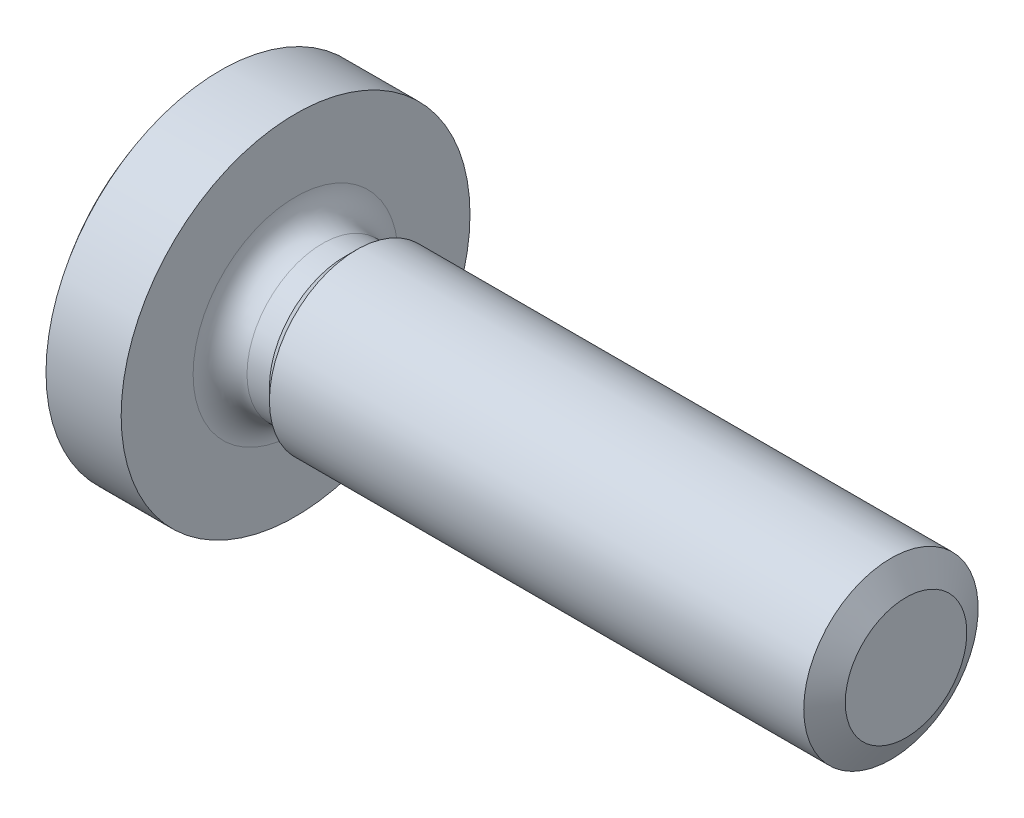
ISO-10303-21;
HEADER;
FILE_DESCRIPTION(('STEP AP214'),'2;1');
FILE_NAME('part.step','',(''),(''),'','','');
FILE_SCHEMA(('AUTOMOTIVE_DESIGN { 1 0 10303 214 1 1 1 1 }'));
ENDSEC;
DATA;
#1=APPLICATION_CONTEXT('core data for automotive mechanical design processes');
#2=APPLICATION_PROTOCOL_DEFINITION('international standard','automotive_design',2000,#1);
#3=PRODUCT_CONTEXT('',#1,'mechanical');
#4=PRODUCT('Part','Part','',(#3));
#5=PRODUCT_RELATED_PRODUCT_CATEGORY('part','',(#4));
#6=PRODUCT_DEFINITION_FORMATION('','',#4);
#7=PRODUCT_DEFINITION_CONTEXT('part definition',#1,'design');
#8=PRODUCT_DEFINITION('design','',#6,#7);
#9=PRODUCT_DEFINITION_SHAPE('','',#8);
#10=(LENGTH_UNIT() NAMED_UNIT(*) SI_UNIT(.MILLI.,.METRE.));
#11=(NAMED_UNIT(*) PLANE_ANGLE_UNIT() SI_UNIT($,.RADIAN.));
#12=(NAMED_UNIT(*) SI_UNIT($,.STERADIAN.) SOLID_ANGLE_UNIT());
#13=UNCERTAINTY_MEASURE_WITH_UNIT(LENGTH_MEASURE(1.E-05),#10,'distance_accuracy_value','');
#14=(GEOMETRIC_REPRESENTATION_CONTEXT(3) GLOBAL_UNCERTAINTY_ASSIGNED_CONTEXT((#13)) GLOBAL_UNIT_ASSIGNED_CONTEXT((#10,
#11,#12)) REPRESENTATION_CONTEXT('',''));
#15=CARTESIAN_POINT('',(0.,0.,0.));
#16=DIRECTION('',(0.,0.,1.));
#17=DIRECTION('',(1.,0.,0.));
#18=AXIS2_PLACEMENT_3D('',#15,#16,#17);
#19=CARTESIAN_POINT('',(2.4,0.,0.));
#20=DIRECTION('',(0.144306893071729,0.,-0.989532981063282));
#21=DIRECTION('',(-0.989532981063282,0.,-0.144306893071729));
#22=AXIS2_PLACEMENT_3D('',#19,#20,#21);
#23=PLANE('',#22);
#24=DIRECTION('',(-0.732931208059297,-0.671853607387689,-0.106885801175314));
#25=VECTOR('',#24,1.);
#26=CARTESIAN_POINT('',(2.4,0.,0.));
#27=LINE('',#26,#25);
#28=CARTESIAN_POINT('',(2.4,0.,0.));
#29=VERTEX_POINT('',#28);
#30=CARTESIAN_POINT('',(0.299339193338267,-1.92560573943992,-0.30634636763817));
#31=VERTEX_POINT('',#30);
#32=EDGE_CURVE('E155',#29,#31,#27,.T.);
#33=ORIENTED_EDGE('',*,*,#32,.F.);
#34=DIRECTION('',(-0.979387903800927,-0.142827402637635,-0.142827402637635));
#35=VECTOR('',#34,1.);
#36=CARTESIAN_POINT('',(2.4,0.,0.));
#37=LINE('',#36,#35);
#38=CARTESIAN_POINT('',(0.0185820115886168,-0.347290123309992,-0.347290123309993));
#39=VERTEX_POINT('',#38);
#40=EDGE_CURVE('E116',#29,#39,#37,.T.);
#41=ORIENTED_EDGE('',*,*,#40,.T.);
#42=CARTESIAN_POINT('',(6.41461963450914,0.,0.585465363365916));
#43=DIRECTION('',(0.144306893071729,0.,-0.989532981063282));
#44=DIRECTION('',(-0.989532981063282,0.,-0.144306893071729));
#45=AXIS2_PLACEMENT_3D('',#42,#43,#44);
#46=CIRCLE('',#45,6.47301633718682);
#47=EDGE_CURVE('E129',#31,#39,#46,.T.);
#48=ORIENTED_EDGE('',*,*,#47,.F.);
#49=EDGE_LOOP('',(#33,#41,#48));
#50=FACE_BOUND('',#49,.T.);
#51=ADVANCED_FACE('F36',(#50),#23,.F.);
#52=CARTESIAN_POINT('',(2.4,0.,0.));
#53=DIRECTION('',(0.144306893071729,0.,0.989532981063282));
#54=DIRECTION('',(0.989532981063282,0.,-0.144306893071729));
#55=AXIS2_PLACEMENT_3D('',#52,#53,#54);
#56=PLANE('',#55);
#57=CARTESIAN_POINT('',(6.41461963450914,0.,-0.585465363365916));
#58=DIRECTION('',(0.144306893071729,0.,0.989532981063282));
#59=DIRECTION('',(0.989532981063282,0.,-0.144306893071729));
#60=AXIS2_PLACEMENT_3D('',#57,#58,#59);
#61=CIRCLE('',#60,6.47301633718682);
#62=CARTESIAN_POINT('',(0.0185820115886177,-0.347290123309995,0.347290123309993));
#63=VERTEX_POINT('',#62);
#64=CARTESIAN_POINT('',(0.299339193338266,-1.92560573943992,0.30634636763817));
#65=VERTEX_POINT('',#64);
#66=EDGE_CURVE('E59',#63,#65,#61,.T.);
#67=ORIENTED_EDGE('',*,*,#66,.F.);
#68=DIRECTION('',(0.979387903800927,0.142827402637636,-0.142827402637635));
#69=VECTOR('',#68,1.);
#70=CARTESIAN_POINT('',(2.4,0.,0.));
#71=LINE('',#70,#69);
#72=EDGE_CURVE('E11',#63,#29,#71,.T.);
#73=ORIENTED_EDGE('',*,*,#72,.T.);
#74=DIRECTION('',(-0.732931208059297,-0.671853607387689,0.106885801175314));
#75=VECTOR('',#74,1.);
#76=CARTESIAN_POINT('',(2.4,0.,0.));
#77=LINE('',#76,#75);
#78=EDGE_CURVE('E156',#29,#65,#77,.T.);
#79=ORIENTED_EDGE('',*,*,#78,.T.);
#80=EDGE_LOOP('',(#67,#73,#79));
#81=FACE_BOUND('',#80,.T.);
#82=ADVANCED_FACE('F171',(#81),#56,.F.);
#83=CARTESIAN_POINT('',(-1.33175770411172,0.,0.));
#84=DIRECTION('',(-1.,0.,0.));
#85=DIRECTION('',(0.,0.,1.));
#86=AXIS2_PLACEMENT_3D('',#83,#84,#85);
#87=CYLINDRICAL_SURFACE('',#86,2.);
#88=CARTESIAN_POINT('',(4.5,0.,0.));
#89=DIRECTION('',(-1.,0.,0.));
#90=DIRECTION('',(0.,0.,1.));
#91=AXIS2_PLACEMENT_3D('',#88,#89,#90);
#92=CIRCLE('',#91,2.);
#93=CARTESIAN_POINT('',(4.5,0.,2.));
#94=VERTEX_POINT('',#93);
#95=EDGE_CURVE('E192',#94,#94,#92,.T.);
#96=ORIENTED_EDGE('',*,*,#95,.F.);
#97=EDGE_LOOP('',(#96));
#98=FACE_BOUND('',#97,.T.);
#99=CARTESIAN_POINT('',(16.753791204021,0.,0.));
#100=DIRECTION('',(-1.,0.,0.));
#101=DIRECTION('',(0.,0.,1.));
#102=AXIS2_PLACEMENT_3D('',#99,#100,#101);
#103=CIRCLE('',#102,2.);
#104=CARTESIAN_POINT('',(16.753791204021,0.,2.));
#105=VERTEX_POINT('',#104);
#106=EDGE_CURVE('E189',#105,#105,#103,.T.);
#107=ORIENTED_EDGE('',*,*,#106,.T.);
#108=EDGE_LOOP('',(#107));
#109=FACE_BOUND('',#108,.T.);
#110=ADVANCED_FACE('F236',(#98,#109),#87,.T.);
#111=CARTESIAN_POINT('',(6.5,0.,0.));
#112=DIRECTION('',(-1.,0.,0.));
#113=DIRECTION('',(0.,1.,0.));
#114=AXIS2_PLACEMENT_3D('',#111,#112,#113);
#115=SPHERICAL_SURFACE('',#114,6.5);
#116=CARTESIAN_POINT('',(4.62792452830189,0.,-2.0422641509434));
#117=DIRECTION('',(0.675724628517346,0.,0.737154140200741));
#118=DIRECTION('',(0.737154140200741,0.,-0.675724628517346));
#119=AXIS2_PLACEMENT_3D('',#116,#117,#118);
#120=CIRCLE('',#119,5.88000770118864);
#121=CARTESIAN_POINT('',(0.299339193338266,0.306346367638162,1.92560573943992));
#122=VERTEX_POINT('',#121);
#123=CARTESIAN_POINT('',(0.299339193338267,-0.306346367638176,1.92560573943992));
#124=VERTEX_POINT('',#123);
#125=EDGE_CURVE('E122',#122,#124,#120,.T.);
#126=ORIENTED_EDGE('',*,*,#125,.T.);
#127=CARTESIAN_POINT('',(6.41461963450914,0.585465363365916,0.));
#128=DIRECTION('',(0.144306893071729,-0.989532981063282,0.));
#129=DIRECTION('',(0.989532981063282,0.144306893071729,0.));
#130=AXIS2_PLACEMENT_3D('',#127,#128,#129);
#131=CIRCLE('',#130,6.47301633718682);
#132=EDGE_CURVE('E138',#124,#63,#131,.T.);
#133=ORIENTED_EDGE('',*,*,#132,.T.);
#134=ORIENTED_EDGE('',*,*,#66,.T.);
#135=CARTESIAN_POINT('',(4.62792452830189,2.0422641509434,0.));
#136=DIRECTION('',(0.675724628517346,-0.737154140200741,0.));
#137=DIRECTION('',(0.737154140200741,0.675724628517346,0.));
#138=AXIS2_PLACEMENT_3D('',#135,#136,#137);
#139=CIRCLE('',#138,5.88000770118864);
#140=EDGE_CURVE('E168',#65,#31,#139,.T.);
#141=ORIENTED_EDGE('',*,*,#140,.T.);
#142=ORIENTED_EDGE('',*,*,#47,.T.);
#143=CARTESIAN_POINT('',(0.299339193338267,-0.306346367638163,-1.92560573943992));
#144=VERTEX_POINT('',#143);
#145=EDGE_CURVE('E118',#39,#144,#131,.T.);
#146=ORIENTED_EDGE('',*,*,#145,.T.);
#147=CARTESIAN_POINT('',(4.62792452830189,0.,2.0422641509434));
#148=DIRECTION('',(0.675724628517346,0.,-0.737154140200741));
#149=DIRECTION('',(-0.737154140200741,0.,-0.675724628517346));
#150=AXIS2_PLACEMENT_3D('',#147,#148,#149);
#151=CIRCLE('',#150,5.88000770118864);
#152=CARTESIAN_POINT('',(0.299339193338266,0.306346367638176,-1.92560573943992));
#153=VERTEX_POINT('',#152);
#154=EDGE_CURVE('E110',#144,#153,#151,.T.);
#155=ORIENTED_EDGE('',*,*,#154,.T.);
#156=CARTESIAN_POINT('',(6.41461963450914,-0.585465363365916,0.));
#157=DIRECTION('',(0.144306893071729,0.989532981063282,0.));
#158=DIRECTION('',(-0.989532981063282,0.144306893071729,0.));
#159=AXIS2_PLACEMENT_3D('',#156,#157,#158);
#160=CIRCLE('',#159,6.47301633718682);
#161=CARTESIAN_POINT('',(0.0185820115886177,0.347290123309994,-0.347290123309993));
#162=VERTEX_POINT('',#161);
#163=EDGE_CURVE('E101',#153,#162,#160,.T.);
#164=ORIENTED_EDGE('',*,*,#163,.T.);
#165=CARTESIAN_POINT('',(0.299339193338267,1.92560573943992,-0.30634636763817));
#166=VERTEX_POINT('',#165);
#167=EDGE_CURVE('E146',#162,#166,#46,.T.);
#168=ORIENTED_EDGE('',*,*,#167,.T.);
#169=CARTESIAN_POINT('',(4.62792452830189,-2.0422641509434,0.));
#170=DIRECTION('',(0.675724628517346,0.737154140200741,0.));
#171=DIRECTION('',(-0.737154140200741,0.675724628517346,0.));
#172=AXIS2_PLACEMENT_3D('',#169,#170,#171);
#173=CIRCLE('',#172,5.88000770118864);
#174=CARTESIAN_POINT('',(0.299339193338266,1.92560573943992,0.306346367638169));
#175=VERTEX_POINT('',#174);
#176=EDGE_CURVE('E159',#166,#175,#173,.T.);
#177=ORIENTED_EDGE('',*,*,#176,.T.);
#178=CARTESIAN_POINT('',(0.0185820115886168,0.347290123309992,0.347290123309993));
#179=VERTEX_POINT('',#178);
#180=EDGE_CURVE('E151',#175,#179,#61,.T.);
#181=ORIENTED_EDGE('',*,*,#180,.T.);
#182=EDGE_CURVE('E51',#179,#122,#160,.T.);
#183=ORIENTED_EDGE('',*,*,#182,.T.);
#184=EDGE_LOOP('',(#126,#133,#134,#141,#142,#146,#155,#164,#168,#177,#181,#183));
#185=FACE_BOUND('',#184,.T.);
#186=CARTESIAN_POINT('',(1.3765246170202,0.,0.));
#187=DIRECTION('',(-1.,0.,0.));
#188=DIRECTION('',(0.,0.,1.));
#189=AXIS2_PLACEMENT_3D('',#186,#187,#188);
#190=CIRCLE('',#189,4.);
#191=CARTESIAN_POINT('',(1.3765246170202,0.,4.));
#192=VERTEX_POINT('',#191);
#193=EDGE_CURVE('E172',#192,#192,#190,.T.);
#194=ORIENTED_EDGE('',*,*,#193,.T.);
#195=EDGE_LOOP('',(#194));
#196=FACE_BOUND('',#195,.T.);
#197=ADVANCED_FACE('F38',(#185,#196),#115,.T.);
#198=CARTESIAN_POINT('',(-1.33175770411172,0.,0.));
#199=DIRECTION('',(-1.,0.,0.));
#200=DIRECTION('',(0.,0.,1.));
#201=AXIS2_PLACEMENT_3D('',#198,#199,#200);
#202=CYLINDRICAL_SURFACE('',#201,4.);
#203=ORIENTED_EDGE('',*,*,#193,.F.);
#204=EDGE_LOOP('',(#203));
#205=FACE_BOUND('',#204,.T.);
#206=CARTESIAN_POINT('',(3.1,0.,0.));
#207=DIRECTION('',(-1.,0.,0.));
#208=DIRECTION('',(0.,0.,1.));
#209=AXIS2_PLACEMENT_3D('',#206,#207,#208);
#210=CIRCLE('',#209,4.);
#211=CARTESIAN_POINT('',(3.1,0.,4.));
#212=VERTEX_POINT('',#211);
#213=EDGE_CURVE('E175',#212,#212,#210,.T.);
#214=ORIENTED_EDGE('',*,*,#213,.T.);
#215=EDGE_LOOP('',(#214));
#216=FACE_BOUND('',#215,.T.);
#217=ADVANCED_FACE('F209',(#205,#216),#202,.T.);
#218=CARTESIAN_POINT('',(3.1,2.35,0.));
#219=DIRECTION('',(-1.,0.,0.));
#220=DIRECTION('',(0.,0.,1.));
#221=AXIS2_PLACEMENT_3D('',#218,#219,#220);
#222=PLANE('',#221);
#223=ORIENTED_EDGE('',*,*,#213,.F.);
#224=EDGE_LOOP('',(#223));
#225=FACE_BOUND('',#224,.T.);
#226=CARTESIAN_POINT('',(3.1,0.,0.));
#227=DIRECTION('',(-1.,0.,0.));
#228=DIRECTION('',(0.,0.,1.));
#229=AXIS2_PLACEMENT_3D('',#226,#227,#228);
#230=CIRCLE('',#229,2.35);
#231=CARTESIAN_POINT('',(3.1,0.,2.35));
#232=VERTEX_POINT('',#231);
#233=EDGE_CURVE('E201',#232,#232,#230,.T.);
#234=ORIENTED_EDGE('',*,*,#233,.T.);
#235=EDGE_LOOP('',(#234));
#236=FACE_BOUND('',#235,.T.);
#237=ADVANCED_FACE('F211',(#225,#236),#222,.F.);
#238=CARTESIAN_POINT('',(3.718,0.,0.));
#239=DIRECTION('',(-1.,0.,0.));
#240=DIRECTION('',(0.,0.,1.));
#241=AXIS2_PLACEMENT_3D('',#238,#239,#240);
#242=TOROIDAL_SURFACE('',#241,2.35,0.618);
#243=ORIENTED_EDGE('',*,*,#233,.F.);
#244=EDGE_LOOP('',(#243));
#245=FACE_BOUND('',#244,.T.);
#246=CARTESIAN_POINT('',(3.718,0.,0.));
#247=DIRECTION('',(-1.,0.,0.));
#248=DIRECTION('',(0.,0.,1.));
#249=AXIS2_PLACEMENT_3D('',#246,#247,#248);
#250=CIRCLE('',#249,1.732);
#251=CARTESIAN_POINT('',(3.718,0.,1.732));
#252=VERTEX_POINT('',#251);
#253=EDGE_CURVE('E198',#252,#252,#250,.T.);
#254=ORIENTED_EDGE('',*,*,#253,.T.);
#255=EDGE_LOOP('',(#254));
#256=FACE_BOUND('',#255,.T.);
#257=ADVANCED_FACE('F214',(#245,#256),#242,.F.);
#258=CARTESIAN_POINT('',(-1.33175770411172,0.,0.));
#259=DIRECTION('',(-1.,0.,0.));
#260=DIRECTION('',(0.,0.,1.));
#261=AXIS2_PLACEMENT_3D('',#258,#259,#260);
#262=CYLINDRICAL_SURFACE('',#261,1.732);
#263=ORIENTED_EDGE('',*,*,#253,.F.);
#264=EDGE_LOOP('',(#263));
#265=FACE_BOUND('',#264,.T.);
#266=CARTESIAN_POINT('',(4.232,0.,0.));
#267=DIRECTION('',(-1.,0.,0.));
#268=DIRECTION('',(0.,0.,1.));
#269=AXIS2_PLACEMENT_3D('',#266,#267,#268);
#270=CIRCLE('',#269,1.732);
#271=CARTESIAN_POINT('',(4.232,0.,1.732));
#272=VERTEX_POINT('',#271);
#273=EDGE_CURVE('E195',#272,#272,#270,.T.);
#274=ORIENTED_EDGE('',*,*,#273,.T.);
#275=EDGE_LOOP('',(#274));
#276=FACE_BOUND('',#275,.T.);
#277=ADVANCED_FACE('F220',(#265,#276),#262,.T.);
#278=CARTESIAN_POINT('',(4.5,0.,0.));
#279=DIRECTION('',(1.,0.,0.));
#280=DIRECTION('',(0.,0.,-1.));
#281=AXIS2_PLACEMENT_3D('',#278,#279,#280);
#282=CONICAL_SURFACE('',#281,2.,0.785398163397443);
#283=ORIENTED_EDGE('',*,*,#273,.F.);
#284=EDGE_LOOP('',(#283));
#285=FACE_BOUND('',#284,.T.);
#286=ORIENTED_EDGE('',*,*,#95,.T.);
#287=EDGE_LOOP('',(#286));
#288=FACE_BOUND('',#287,.T.);
#289=ADVANCED_FACE('F226',(#285,#288),#282,.T.);
#290=CARTESIAN_POINT('',(16.753791204021,0.,0.));
#291=DIRECTION('',(-1.,0.,0.));
#292=DIRECTION('',(0.,0.,1.));
#293=AXIS2_PLACEMENT_3D('',#290,#291,#292);
#294=CONICAL_SURFACE('',#293,2.,1.05188801855299);
#295=CARTESIAN_POINT('',(17.1,0.,0.));
#296=DIRECTION('',(-1.,0.,0.));
#297=DIRECTION('',(0.,0.,1.));
#298=AXIS2_PLACEMENT_3D('',#295,#296,#297);
#299=CIRCLE('',#298,1.3938);
#300=CARTESIAN_POINT('',(17.1,0.,1.3938));
#301=VERTEX_POINT('',#300);
#302=EDGE_CURVE('E160',#301,#301,#299,.T.);
#303=ORIENTED_EDGE('',*,*,#302,.T.);
#304=EDGE_LOOP('',(#303));
#305=FACE_BOUND('',#304,.T.);
#306=ORIENTED_EDGE('',*,*,#106,.F.);
#307=EDGE_LOOP('',(#306));
#308=FACE_BOUND('',#307,.T.);
#309=ADVANCED_FACE('F232',(#305,#308),#294,.T.);
#310=CARTESIAN_POINT('',(17.1,0.,0.));
#311=DIRECTION('',(-1.,0.,0.));
#312=DIRECTION('',(0.,0.,1.));
#313=AXIS2_PLACEMENT_3D('',#310,#311,#312);
#314=PLANE('',#313);
#315=ORIENTED_EDGE('',*,*,#302,.F.);
#316=EDGE_LOOP('',(#315));
#317=FACE_BOUND('',#316,.T.);
#318=ADVANCED_FACE('F243',(#317),#314,.F.);
#319=ORIENTED_EDGE('',*,*,#167,.F.);
#320=DIRECTION('',(0.979387903800927,-0.142827402637636,0.142827402637635));
#321=VECTOR('',#320,1.);
#322=CARTESIAN_POINT('',(2.4,0.,0.));
#323=LINE('',#322,#321);
#324=EDGE_CURVE('E99',#162,#29,#323,.T.);
#325=ORIENTED_EDGE('',*,*,#324,.T.);
#326=DIRECTION('',(-0.732931208059297,0.671853607387689,-0.106885801175314));
#327=VECTOR('',#326,1.);
#328=CARTESIAN_POINT('',(2.4,0.,0.));
#329=LINE('',#328,#327);
#330=EDGE_CURVE('E145',#29,#166,#329,.T.);
#331=ORIENTED_EDGE('',*,*,#330,.T.);
#332=EDGE_LOOP('',(#319,#325,#331));
#333=FACE_BOUND('',#332,.T.);
#334=ADVANCED_FACE('F143',(#333),#23,.F.);
#335=CARTESIAN_POINT('',(0.,2.2,-0.35));
#336=DIRECTION('',(0.675724628517346,0.737154140200741,0.));
#337=DIRECTION('',(-0.737154140200741,0.675724628517346,0.));
#338=AXIS2_PLACEMENT_3D('',#335,#336,#337);
#339=PLANE('',#338);
#340=ORIENTED_EDGE('',*,*,#330,.F.);
#341=DIRECTION('',(-0.732931208059297,0.671853607387689,0.106885801175314));
#342=VECTOR('',#341,1.);
#343=CARTESIAN_POINT('',(2.4,0.,0.));
#344=LINE('',#343,#342);
#345=EDGE_CURVE('E149',#29,#175,#344,.T.);
#346=ORIENTED_EDGE('',*,*,#345,.T.);
#347=ORIENTED_EDGE('',*,*,#176,.F.);
#348=EDGE_LOOP('',(#340,#346,#347));
#349=FACE_BOUND('',#348,.T.);
#350=ADVANCED_FACE('F158',(#349),#339,.F.);
#351=CARTESIAN_POINT('',(0.,-2.2,0.35));
#352=DIRECTION('',(0.675724628517346,-0.737154140200741,0.));
#353=DIRECTION('',(0.737154140200741,0.675724628517346,0.));
#354=AXIS2_PLACEMENT_3D('',#351,#352,#353);
#355=PLANE('',#354);
#356=ORIENTED_EDGE('',*,*,#78,.F.);
#357=ORIENTED_EDGE('',*,*,#32,.T.);
#358=ORIENTED_EDGE('',*,*,#140,.F.);
#359=EDGE_LOOP('',(#356,#357,#358));
#360=FACE_BOUND('',#359,.T.);
#361=ADVANCED_FACE('F167',(#360),#355,.F.);
#362=ORIENTED_EDGE('',*,*,#345,.F.);
#363=DIRECTION('',(-0.979387903800927,0.142827402637635,0.142827402637635));
#364=VECTOR('',#363,1.);
#365=CARTESIAN_POINT('',(2.4,0.,0.));
#366=LINE('',#365,#364);
#367=EDGE_CURVE('E44',#29,#179,#366,.T.);
#368=ORIENTED_EDGE('',*,*,#367,.T.);
#369=ORIENTED_EDGE('',*,*,#180,.F.);
#370=EDGE_LOOP('',(#362,#368,#369));
#371=FACE_BOUND('',#370,.T.);
#372=ADVANCED_FACE('F150',(#371),#56,.F.);
#373=CARTESIAN_POINT('',(2.4,0.,0.));
#374=DIRECTION('',(0.144306893071729,-0.989532981063282,0.));
#375=DIRECTION('',(-0.989532981063282,-0.144306893071729,0.));
#376=AXIS2_PLACEMENT_3D('',#373,#374,#375);
#377=PLANE('',#376);
#378=DIRECTION('',(-0.732931208059297,-0.106885801175317,0.671853607387689));
#379=VECTOR('',#378,1.);
#380=CARTESIAN_POINT('',(2.4,0.,0.));
#381=LINE('',#380,#379);
#382=EDGE_CURVE('E113',#29,#124,#381,.T.);
#383=ORIENTED_EDGE('',*,*,#382,.F.);
#384=ORIENTED_EDGE('',*,*,#72,.F.);
#385=ORIENTED_EDGE('',*,*,#132,.F.);
#386=EDGE_LOOP('',(#383,#384,#385));
#387=FACE_BOUND('',#386,.T.);
#388=ADVANCED_FACE('F137',(#387),#377,.F.);
#389=CARTESIAN_POINT('',(2.4,0.,0.));
#390=DIRECTION('',(0.144306893071729,0.989532981063282,0.));
#391=DIRECTION('',(0.989532981063282,-0.144306893071729,0.));
#392=AXIS2_PLACEMENT_3D('',#389,#390,#391);
#393=PLANE('',#392);
#394=ORIENTED_EDGE('',*,*,#367,.F.);
#395=DIRECTION('',(-0.732931208059297,0.106885801175312,0.671853607387689));
#396=VECTOR('',#395,1.);
#397=CARTESIAN_POINT('',(2.4,0.,0.));
#398=LINE('',#397,#396);
#399=EDGE_CURVE('E104',#29,#122,#398,.T.);
#400=ORIENTED_EDGE('',*,*,#399,.T.);
#401=ORIENTED_EDGE('',*,*,#182,.F.);
#402=EDGE_LOOP('',(#394,#400,#401));
#403=FACE_BOUND('',#402,.T.);
#404=ADVANCED_FACE('F125',(#403),#393,.F.);
#405=CARTESIAN_POINT('',(0.,-0.350000000000008,2.2));
#406=DIRECTION('',(0.675724628517346,0.,0.737154140200741));
#407=DIRECTION('',(-0.737154140200741,0.,0.675724628517346));
#408=AXIS2_PLACEMENT_3D('',#405,#406,#407);
#409=PLANE('',#408);
#410=ORIENTED_EDGE('',*,*,#399,.F.);
#411=ORIENTED_EDGE('',*,*,#382,.T.);
#412=ORIENTED_EDGE('',*,*,#125,.F.);
#413=EDGE_LOOP('',(#410,#411,#412));
#414=FACE_BOUND('',#413,.T.);
#415=ADVANCED_FACE('F133',(#414),#409,.F.);
#416=ORIENTED_EDGE('',*,*,#40,.F.);
#417=DIRECTION('',(-0.732931208059297,-0.106885801175312,-0.671853607387689));
#418=VECTOR('',#417,1.);
#419=CARTESIAN_POINT('',(2.4,0.,0.));
#420=LINE('',#419,#418);
#421=EDGE_CURVE('E107',#29,#144,#420,.T.);
#422=ORIENTED_EDGE('',*,*,#421,.T.);
#423=ORIENTED_EDGE('',*,*,#145,.F.);
#424=EDGE_LOOP('',(#416,#422,#423));
#425=FACE_BOUND('',#424,.T.);
#426=ADVANCED_FACE('F117',(#425),#377,.F.);
#427=CARTESIAN_POINT('',(0.,0.350000000000008,-2.2));
#428=DIRECTION('',(0.675724628517346,0.,-0.737154140200741));
#429=DIRECTION('',(0.737154140200741,0.,0.675724628517346));
#430=AXIS2_PLACEMENT_3D('',#427,#428,#429);
#431=PLANE('',#430);
#432=ORIENTED_EDGE('',*,*,#421,.F.);
#433=DIRECTION('',(-0.732931208059297,0.106885801175317,-0.671853607387689));
#434=VECTOR('',#433,1.);
#435=CARTESIAN_POINT('',(2.4,0.,0.));
#436=LINE('',#435,#434);
#437=EDGE_CURVE('E95',#29,#153,#436,.T.);
#438=ORIENTED_EDGE('',*,*,#437,.T.);
#439=ORIENTED_EDGE('',*,*,#154,.F.);
#440=EDGE_LOOP('',(#432,#438,#439));
#441=FACE_BOUND('',#440,.T.);
#442=ADVANCED_FACE('F109',(#441),#431,.F.);
#443=ORIENTED_EDGE('',*,*,#437,.F.);
#444=ORIENTED_EDGE('',*,*,#324,.F.);
#445=ORIENTED_EDGE('',*,*,#163,.F.);
#446=EDGE_LOOP('',(#443,#444,#445));
#447=FACE_BOUND('',#446,.T.);
#448=ADVANCED_FACE('F97',(#447),#393,.F.);
#449=CLOSED_SHELL('',(#51,#82,#110,#197,#217,#237,#257,#277,#289,#309,#318,#334,#350,#361,#372,
#388,#404,#415,#426,#442,#448));
#450=MANIFOLD_SOLID_BREP('B2',#449);
#451=ADVANCED_BREP_SHAPE_REPRESENTATION('',(#18,#450),#14);
#452=SHAPE_DEFINITION_REPRESENTATION(#9,#451);
ENDSEC;
END-ISO-10303-21;
